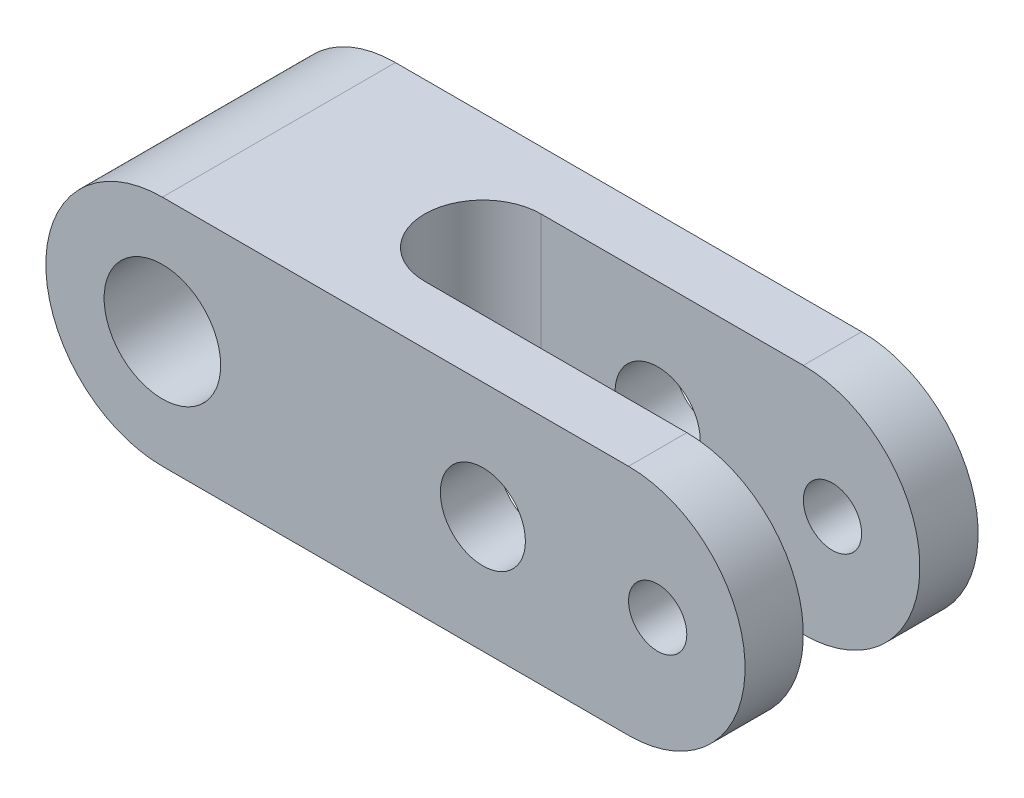
ISO-10303-21;
HEADER;
FILE_DESCRIPTION(('STEP AP214'),'2;1');
FILE_NAME('part.step','',(''),(''),'','','');
FILE_SCHEMA(('AUTOMOTIVE_DESIGN { 1 0 10303 214 1 1 1 1 }'));
ENDSEC;
DATA;
#1=APPLICATION_CONTEXT('core data for automotive mechanical design processes');
#2=APPLICATION_PROTOCOL_DEFINITION('international standard','automotive_design',2000,#1);
#3=PRODUCT_CONTEXT('',#1,'mechanical');
#4=PRODUCT('Part','Part','',(#3));
#5=PRODUCT_RELATED_PRODUCT_CATEGORY('part','',(#4));
#6=PRODUCT_DEFINITION_FORMATION('','',#4);
#7=PRODUCT_DEFINITION_CONTEXT('part definition',#1,'design');
#8=PRODUCT_DEFINITION('design','',#6,#7);
#9=PRODUCT_DEFINITION_SHAPE('','',#8);
#10=(LENGTH_UNIT() NAMED_UNIT(*) SI_UNIT(.MILLI.,.METRE.));
#11=(NAMED_UNIT(*) PLANE_ANGLE_UNIT() SI_UNIT($,.RADIAN.));
#12=(NAMED_UNIT(*) SI_UNIT($,.STERADIAN.) SOLID_ANGLE_UNIT());
#13=UNCERTAINTY_MEASURE_WITH_UNIT(LENGTH_MEASURE(1.E-05),#10,'distance_accuracy_value','');
#14=(GEOMETRIC_REPRESENTATION_CONTEXT(3) GLOBAL_UNCERTAINTY_ASSIGNED_CONTEXT((#13)) GLOBAL_UNIT_ASSIGNED_CONTEXT((#10,
#11,#12)) REPRESENTATION_CONTEXT('',''));
#15=CARTESIAN_POINT('',(0.,0.,0.));
#16=DIRECTION('',(0.,0.,1.));
#17=DIRECTION('',(1.,0.,0.));
#18=AXIS2_PLACEMENT_3D('',#15,#16,#17);
#19=CARTESIAN_POINT('',(-3.17500000000001,12.7,0.));
#20=DIRECTION('',(0.,1.,0.));
#21=DIRECTION('',(-1.,0.,0.));
#22=AXIS2_PLACEMENT_3D('',#19,#20,#21);
#23=CYLINDRICAL_SURFACE('',#22,6.35);
#24=DIRECTION('',(0.,-1.,0.));
#25=VECTOR('',#24,1.);
#26=CARTESIAN_POINT('',(-3.17500000000001,12.7,-6.35));
#27=LINE('',#26,#25);
#28=CARTESIAN_POINT('',(-3.17500000000001,12.7,-6.35));
#29=VERTEX_POINT('',#28);
#30=CARTESIAN_POINT('',(-3.175,-12.7,-6.35));
#31=VERTEX_POINT('',#30);
#32=EDGE_CURVE('E124',#29,#31,#27,.T.);
#33=ORIENTED_EDGE('',*,*,#32,.F.);
#34=CARTESIAN_POINT('',(-3.17500000000001,12.7,0.));
#35=DIRECTION('',(0.,-1.,0.));
#36=DIRECTION('',(1.,0.,0.));
#37=AXIS2_PLACEMENT_3D('',#34,#35,#36);
#38=CIRCLE('',#37,6.35);
#39=CARTESIAN_POINT('',(-3.17500000000001,12.7,6.35));
#40=VERTEX_POINT('',#39);
#41=EDGE_CURVE('E43',#29,#40,#38,.F.);
#42=ORIENTED_EDGE('',*,*,#41,.T.);
#43=DIRECTION('',(0.,-1.,0.));
#44=VECTOR('',#43,1.);
#45=CARTESIAN_POINT('',(-3.17500000000001,12.7,6.35));
#46=LINE('',#45,#44);
#47=CARTESIAN_POINT('',(-3.175,-12.7,6.35));
#48=VERTEX_POINT('',#47);
#49=EDGE_CURVE('E137',#48,#40,#46,.F.);
#50=ORIENTED_EDGE('',*,*,#49,.F.);
#51=CARTESIAN_POINT('',(-3.175,-12.7,0.));
#52=DIRECTION('',(0.,1.,0.));
#53=DIRECTION('',(-1.,0.,0.));
#54=AXIS2_PLACEMENT_3D('',#51,#52,#53);
#55=CIRCLE('',#54,6.35);
#56=EDGE_CURVE('E11',#48,#31,#55,.F.);
#57=ORIENTED_EDGE('',*,*,#56,.T.);
#58=EDGE_LOOP('',(#33,#42,#50,#57));
#59=FACE_BOUND('',#58,.T.);
#60=ADVANCED_FACE('F35',(#59),#23,.F.);
#61=CARTESIAN_POINT('',(25.4,0.,12.7));
#62=DIRECTION('',(0.,0.,-1.));
#63=DIRECTION('',(-1.,0.,0.));
#64=AXIS2_PLACEMENT_3D('',#61,#62,#63);
#65=CYLINDRICAL_SURFACE('',#64,12.7);
#66=DIRECTION('',(0.,0.,-1.));
#67=VECTOR('',#66,1.);
#68=CARTESIAN_POINT('',(25.4,12.7,12.7));
#69=LINE('',#68,#67);
#70=CARTESIAN_POINT('',(25.4,12.7,-6.35));
#71=VERTEX_POINT('',#70);
#72=CARTESIAN_POINT('',(25.4,12.7,-12.7));
#73=VERTEX_POINT('',#72);
#74=EDGE_CURVE('E193',#71,#73,#69,.T.);
#75=ORIENTED_EDGE('',*,*,#74,.F.);
#76=CARTESIAN_POINT('',(25.4,0.,-6.35));
#77=DIRECTION('',(0.,0.,-1.));
#78=DIRECTION('',(-1.,0.,0.));
#79=AXIS2_PLACEMENT_3D('',#76,#77,#78);
#80=CIRCLE('',#79,12.7);
#81=CARTESIAN_POINT('',(25.4,-12.7,-6.35));
#82=VERTEX_POINT('',#81);
#83=EDGE_CURVE('E152',#71,#82,#80,.T.);
#84=ORIENTED_EDGE('',*,*,#83,.T.);
#85=DIRECTION('',(0.,0.,-1.));
#86=VECTOR('',#85,1.);
#87=CARTESIAN_POINT('',(25.4,-12.7,12.7));
#88=LINE('',#87,#86);
#89=CARTESIAN_POINT('',(25.4,-12.7,-12.7));
#90=VERTEX_POINT('',#89);
#91=EDGE_CURVE('E121',#82,#90,#88,.T.);
#92=ORIENTED_EDGE('',*,*,#91,.T.);
#93=CARTESIAN_POINT('',(25.4,0.,-12.7));
#94=DIRECTION('',(0.,0.,1.));
#95=DIRECTION('',(1.,0.,0.));
#96=AXIS2_PLACEMENT_3D('',#93,#94,#95);
#97=CIRCLE('',#96,12.7);
#98=EDGE_CURVE('E189',#90,#73,#97,.T.);
#99=ORIENTED_EDGE('',*,*,#98,.T.);
#100=EDGE_LOOP('',(#75,#84,#92,#99));
#101=FACE_BOUND('',#100,.T.);
#102=ADVANCED_FACE('F202',(#101),#65,.T.);
#103=CARTESIAN_POINT('',(9.525,0.,-30.6605122421383));
#104=DIRECTION('',(0.,0.,1.));
#105=DIRECTION('',(1.,0.,0.));
#106=AXIS2_PLACEMENT_3D('',#103,#104,#105);
#107=CYLINDRICAL_SURFACE('',#106,4.6355);
#108=CARTESIAN_POINT('',(9.525,0.,-6.35));
#109=DIRECTION('',(0.,0.,-1.));
#110=DIRECTION('',(-1.,0.,0.));
#111=AXIS2_PLACEMENT_3D('',#108,#109,#110);
#112=CIRCLE('',#111,4.6355);
#113=CARTESIAN_POINT('',(14.1605,0.,-6.34999999999999));
#114=VERTEX_POINT('',#113);
#115=EDGE_CURVE('E134',#114,#114,#112,.F.);
#116=CARTESIAN_POINT('',(9.525,0.,-12.7));
#117=DIRECTION('',(0.,0.,1.));
#118=DIRECTION('',(1.,0.,0.));
#119=AXIS2_PLACEMENT_3D('',#116,#117,#118);
#120=CIRCLE('',#119,4.6355);
#121=CARTESIAN_POINT('',(14.1605,0.,-12.7));
#122=VERTEX_POINT('',#121);
#123=EDGE_CURVE('E160',#122,#122,#120,.F.);
#124=CARTESIAN_POINT('',(14.1605,0.,-6.34999999999999));
#125=CARTESIAN_POINT('',(14.1605,0.,-6.41614583333333));
#126=CARTESIAN_POINT('',(14.1605,0.,-6.48229166666666));
#127=CARTESIAN_POINT('',(14.1605,0.,-6.61458333333333));
#128=CARTESIAN_POINT('',(14.1605,0.,-6.68072916666666));
#129=CARTESIAN_POINT('',(14.1605,0.,-6.81302083333333));
#130=CARTESIAN_POINT('',(14.1605,0.,-6.87916666666666));
#131=CARTESIAN_POINT('',(14.1605,0.,-7.01145833333333));
#132=CARTESIAN_POINT('',(14.1605,0.,-7.07760416666666));
#133=CARTESIAN_POINT('',(14.1605,0.,-7.20989583333333));
#134=CARTESIAN_POINT('',(14.1605,0.,-7.27604166666666));
#135=CARTESIAN_POINT('',(14.1605,0.,-7.40833333333333));
#136=CARTESIAN_POINT('',(14.1605,0.,-7.47447916666666));
#137=CARTESIAN_POINT('',(14.1605,0.,-7.60677083333333));
#138=CARTESIAN_POINT('',(14.1605,0.,-7.67291666666666));
#139=CARTESIAN_POINT('',(14.1605,0.,-7.80520833333333));
#140=CARTESIAN_POINT('',(14.1605,0.,-7.87135416666666));
#141=CARTESIAN_POINT('',(14.1605,0.,-8.00364583333333));
#142=CARTESIAN_POINT('',(14.1605,0.,-8.06979166666666));
#143=CARTESIAN_POINT('',(14.1605,0.,-8.20208333333333));
#144=CARTESIAN_POINT('',(14.1605,0.,-8.26822916666666));
#145=CARTESIAN_POINT('',(14.1605,0.,-8.40052083333333));
#146=CARTESIAN_POINT('',(14.1605,0.,-8.46666666666666));
#147=CARTESIAN_POINT('',(14.1605,0.,-8.59895833333333));
#148=CARTESIAN_POINT('',(14.1605,0.,-8.66510416666666));
#149=CARTESIAN_POINT('',(14.1605,0.,-8.79739583333333));
#150=CARTESIAN_POINT('',(14.1605,0.,-8.86354166666666));
#151=CARTESIAN_POINT('',(14.1605,0.,-8.99583333333333));
#152=CARTESIAN_POINT('',(14.1605,0.,-9.06197916666666));
#153=CARTESIAN_POINT('',(14.1605,0.,-9.19427083333333));
#154=CARTESIAN_POINT('',(14.1605,0.,-9.26041666666666));
#155=CARTESIAN_POINT('',(14.1605,0.,-9.39270833333333));
#156=CARTESIAN_POINT('',(14.1605,0.,-9.45885416666667));
#157=CARTESIAN_POINT('',(14.1605,0.,-9.59114583333333));
#158=CARTESIAN_POINT('',(14.1605,0.,-9.65729166666666));
#159=CARTESIAN_POINT('',(14.1605,0.,-9.78958333333333));
#160=CARTESIAN_POINT('',(14.1605,0.,-9.85572916666666));
#161=CARTESIAN_POINT('',(14.1605,0.,-9.98802083333333));
#162=CARTESIAN_POINT('',(14.1605,0.,-10.0541666666667));
#163=CARTESIAN_POINT('',(14.1605,0.,-10.1864583333333));
#164=CARTESIAN_POINT('',(14.1605,0.,-10.2526041666667));
#165=CARTESIAN_POINT('',(14.1605,0.,-10.3848958333333));
#166=CARTESIAN_POINT('',(14.1605,0.,-10.4510416666667));
#167=CARTESIAN_POINT('',(14.1605,0.,-10.5833333333333));
#168=CARTESIAN_POINT('',(14.1605,0.,-10.6494791666667));
#169=CARTESIAN_POINT('',(14.1605,0.,-10.7817708333333));
#170=CARTESIAN_POINT('',(14.1605,0.,-10.8479166666667));
#171=CARTESIAN_POINT('',(14.1605,0.,-10.9802083333333));
#172=CARTESIAN_POINT('',(14.1605,0.,-11.0463541666667));
#173=CARTESIAN_POINT('',(14.1605,0.,-11.1786458333333));
#174=CARTESIAN_POINT('',(14.1605,0.,-11.2447916666667));
#175=CARTESIAN_POINT('',(14.1605,0.,-11.3770833333333));
#176=CARTESIAN_POINT('',(14.1605,0.,-11.4432291666667));
#177=CARTESIAN_POINT('',(14.1605,0.,-11.5755208333333));
#178=CARTESIAN_POINT('',(14.1605,0.,-11.6416666666667));
#179=CARTESIAN_POINT('',(14.1605,0.,-11.7739583333333));
#180=CARTESIAN_POINT('',(14.1605,0.,-11.8401041666667));
#181=CARTESIAN_POINT('',(14.1605,0.,-11.9723958333333));
#182=CARTESIAN_POINT('',(14.1605,0.,-12.0385416666667));
#183=CARTESIAN_POINT('',(14.1605,0.,-12.1708333333333));
#184=CARTESIAN_POINT('',(14.1605,0.,-12.2369791666667));
#185=CARTESIAN_POINT('',(14.1605,0.,-12.3692708333333));
#186=CARTESIAN_POINT('',(14.1605,0.,-12.4354166666667));
#187=CARTESIAN_POINT('',(14.1605,0.,-12.5677083333333));
#188=CARTESIAN_POINT('',(14.1605,0.,-12.6338541666667));
#189=CARTESIAN_POINT('',(14.1605,0.,-12.7));
#190=B_SPLINE_CURVE_WITH_KNOTS('',3,(#124,#125,#126,#127,#128,#129,#130,#131,#132,#133,#134,
#135,#136,#137,#138,#139,#140,#141,#142,#143,#144,#145,#146,#147,#148,#149,#150,#151,#152,#153,
#154,#155,#156,#157,#158,#159,#160,#161,#162,#163,#164,#165,#166,#167,#168,#169,#170,#171,#172,
#173,#174,#175,#176,#177,#178,#179,#180,#181,#182,#183,#184,#185,#186,#187,#188,#189),
.UNSPECIFIED.,.F.,.F.,(4,2,2,2,2,2,2,2,2,2,2,2,2,2,2,2,2,2,2,2,2,2,2,2,2,2,2,2,2,2,2,2,4),(0.,
0.198437499999999,0.396875000000001,0.5953125,0.793750000000003,0.992187500000002,1.190625,
1.3890625,1.5875,1.7859375,1.984375,2.1828125,2.38125,2.5796875,2.778125,2.97656250000001,3.175,
3.3734375,3.57187500000001,3.7703125,3.96875000000001,4.16718750000001,4.365625,
4.56406250000001,4.76250000000001,4.96093750000001,5.15937500000001,5.35781250000001,
5.55625000000001,5.75468750000001,5.95312500000001,6.15156250000001,6.35000000000001),.UNSPECIFIED.);
#191=EDGE_CURVE('BSEAM227',#114,#122,#190,.T.);
#192=ORIENTED_EDGE('',*,*,#115,.T.);
#193=ORIENTED_EDGE('',*,*,#123,.T.);
#194=ORIENTED_EDGE('',*,*,#191,.T.);
#195=ORIENTED_EDGE('',*,*,#191,.F.);
#196=EDGE_LOOP('',(#192,#194,#193,#195));
#197=FACE_BOUND('',#196,.T.);
#198=ADVANCED_FACE('F227',(#197),#107,.F.);
#199=CARTESIAN_POINT('',(28.575,0.,-30.6605122421383));
#200=DIRECTION('',(0.,0.,1.));
#201=DIRECTION('',(1.,0.,0.));
#202=AXIS2_PLACEMENT_3D('',#199,#200,#201);
#203=CYLINDRICAL_SURFACE('',#202,3.175);
#204=CARTESIAN_POINT('',(28.575,0.,-6.35));
#205=DIRECTION('',(0.,0.,-1.));
#206=DIRECTION('',(-1.,0.,0.));
#207=AXIS2_PLACEMENT_3D('',#204,#205,#206);
#208=CIRCLE('',#207,3.175);
#209=CARTESIAN_POINT('',(31.75,0.,-6.34999999999999));
#210=VERTEX_POINT('',#209);
#211=EDGE_CURVE('E107',#210,#210,#208,.F.);
#212=CARTESIAN_POINT('',(28.575,0.,-12.7));
#213=DIRECTION('',(0.,0.,1.));
#214=DIRECTION('',(1.,0.,0.));
#215=AXIS2_PLACEMENT_3D('',#212,#213,#214);
#216=CIRCLE('',#215,3.175);
#217=CARTESIAN_POINT('',(31.75,0.,-12.7));
#218=VERTEX_POINT('',#217);
#219=EDGE_CURVE('E159',#218,#218,#216,.F.);
#220=CARTESIAN_POINT('',(31.75,0.,-6.34999999999999));
#221=CARTESIAN_POINT('',(31.75,0.,-6.41614583333333));
#222=CARTESIAN_POINT('',(31.75,0.,-6.48229166666666));
#223=CARTESIAN_POINT('',(31.75,0.,-6.61458333333333));
#224=CARTESIAN_POINT('',(31.75,0.,-6.68072916666666));
#225=CARTESIAN_POINT('',(31.75,0.,-6.81302083333333));
#226=CARTESIAN_POINT('',(31.75,0.,-6.87916666666666));
#227=CARTESIAN_POINT('',(31.75,0.,-7.01145833333333));
#228=CARTESIAN_POINT('',(31.75,0.,-7.07760416666666));
#229=CARTESIAN_POINT('',(31.75,0.,-7.20989583333333));
#230=CARTESIAN_POINT('',(31.75,0.,-7.27604166666666));
#231=CARTESIAN_POINT('',(31.75,0.,-7.40833333333333));
#232=CARTESIAN_POINT('',(31.75,0.,-7.47447916666666));
#233=CARTESIAN_POINT('',(31.75,0.,-7.60677083333333));
#234=CARTESIAN_POINT('',(31.75,0.,-7.67291666666666));
#235=CARTESIAN_POINT('',(31.75,0.,-7.80520833333333));
#236=CARTESIAN_POINT('',(31.75,0.,-7.87135416666666));
#237=CARTESIAN_POINT('',(31.75,0.,-8.00364583333333));
#238=CARTESIAN_POINT('',(31.75,0.,-8.06979166666666));
#239=CARTESIAN_POINT('',(31.75,0.,-8.20208333333333));
#240=CARTESIAN_POINT('',(31.75,0.,-8.26822916666666));
#241=CARTESIAN_POINT('',(31.75,0.,-8.40052083333333));
#242=CARTESIAN_POINT('',(31.75,0.,-8.46666666666666));
#243=CARTESIAN_POINT('',(31.75,0.,-8.59895833333333));
#244=CARTESIAN_POINT('',(31.75,0.,-8.66510416666666));
#245=CARTESIAN_POINT('',(31.75,0.,-8.79739583333333));
#246=CARTESIAN_POINT('',(31.75,0.,-8.86354166666666));
#247=CARTESIAN_POINT('',(31.75,0.,-8.99583333333333));
#248=CARTESIAN_POINT('',(31.75,0.,-9.06197916666666));
#249=CARTESIAN_POINT('',(31.75,0.,-9.19427083333333));
#250=CARTESIAN_POINT('',(31.75,0.,-9.26041666666666));
#251=CARTESIAN_POINT('',(31.75,0.,-9.39270833333333));
#252=CARTESIAN_POINT('',(31.75,0.,-9.45885416666667));
#253=CARTESIAN_POINT('',(31.75,0.,-9.59114583333333));
#254=CARTESIAN_POINT('',(31.75,0.,-9.65729166666666));
#255=CARTESIAN_POINT('',(31.75,0.,-9.78958333333333));
#256=CARTESIAN_POINT('',(31.75,0.,-9.85572916666666));
#257=CARTESIAN_POINT('',(31.75,0.,-9.98802083333333));
#258=CARTESIAN_POINT('',(31.75,0.,-10.0541666666667));
#259=CARTESIAN_POINT('',(31.75,0.,-10.1864583333333));
#260=CARTESIAN_POINT('',(31.75,0.,-10.2526041666667));
#261=CARTESIAN_POINT('',(31.75,0.,-10.3848958333333));
#262=CARTESIAN_POINT('',(31.75,0.,-10.4510416666667));
#263=CARTESIAN_POINT('',(31.75,0.,-10.5833333333333));
#264=CARTESIAN_POINT('',(31.75,0.,-10.6494791666667));
#265=CARTESIAN_POINT('',(31.75,0.,-10.7817708333333));
#266=CARTESIAN_POINT('',(31.75,0.,-10.8479166666667));
#267=CARTESIAN_POINT('',(31.75,0.,-10.9802083333333));
#268=CARTESIAN_POINT('',(31.75,0.,-11.0463541666667));
#269=CARTESIAN_POINT('',(31.75,0.,-11.1786458333333));
#270=CARTESIAN_POINT('',(31.75,0.,-11.2447916666667));
#271=CARTESIAN_POINT('',(31.75,0.,-11.3770833333333));
#272=CARTESIAN_POINT('',(31.75,0.,-11.4432291666667));
#273=CARTESIAN_POINT('',(31.75,0.,-11.5755208333333));
#274=CARTESIAN_POINT('',(31.75,0.,-11.6416666666667));
#275=CARTESIAN_POINT('',(31.75,0.,-11.7739583333333));
#276=CARTESIAN_POINT('',(31.75,0.,-11.8401041666667));
#277=CARTESIAN_POINT('',(31.75,0.,-11.9723958333333));
#278=CARTESIAN_POINT('',(31.75,0.,-12.0385416666667));
#279=CARTESIAN_POINT('',(31.75,0.,-12.1708333333333));
#280=CARTESIAN_POINT('',(31.75,0.,-12.2369791666667));
#281=CARTESIAN_POINT('',(31.75,0.,-12.3692708333333));
#282=CARTESIAN_POINT('',(31.75,0.,-12.4354166666667));
#283=CARTESIAN_POINT('',(31.75,0.,-12.5677083333333));
#284=CARTESIAN_POINT('',(31.75,0.,-12.6338541666667));
#285=CARTESIAN_POINT('',(31.75,0.,-12.7));
#286=B_SPLINE_CURVE_WITH_KNOTS('',3,(#220,#221,#222,#223,#224,#225,#226,#227,#228,#229,#230,
#231,#232,#233,#234,#235,#236,#237,#238,#239,#240,#241,#242,#243,#244,#245,#246,#247,#248,#249,
#250,#251,#252,#253,#254,#255,#256,#257,#258,#259,#260,#261,#262,#263,#264,#265,#266,#267,#268,
#269,#270,#271,#272,#273,#274,#275,#276,#277,#278,#279,#280,#281,#282,#283,#284,#285),
.UNSPECIFIED.,.F.,.F.,(4,2,2,2,2,2,2,2,2,2,2,2,2,2,2,2,2,2,2,2,2,2,2,2,2,2,2,2,2,2,2,2,4),(0.,
0.198437499999999,0.396875000000001,0.5953125,0.793750000000003,0.992187500000002,1.190625,
1.3890625,1.5875,1.7859375,1.984375,2.1828125,2.38125,2.5796875,2.778125,2.97656250000001,3.175,
3.3734375,3.57187500000001,3.7703125,3.96875000000001,4.16718750000001,4.365625,
4.56406250000001,4.76250000000001,4.96093750000001,5.15937500000001,5.35781250000001,
5.55625000000001,5.75468750000001,5.95312500000001,6.15156250000001,6.35000000000001),.UNSPECIFIED.);
#287=EDGE_CURVE('BSEAM244',#210,#218,#286,.T.);
#288=ORIENTED_EDGE('',*,*,#211,.T.);
#289=ORIENTED_EDGE('',*,*,#219,.T.);
#290=ORIENTED_EDGE('',*,*,#287,.T.);
#291=ORIENTED_EDGE('',*,*,#287,.F.);
#292=EDGE_LOOP('',(#288,#290,#289,#291));
#293=FACE_BOUND('',#292,.T.);
#294=ADVANCED_FACE('F244',(#293),#203,.F.);
#295=CARTESIAN_POINT('',(-25.4,0.,12.7));
#296=DIRECTION('',(0.,0.,-1.));
#297=DIRECTION('',(-1.,0.,0.));
#298=AXIS2_PLACEMENT_3D('',#295,#296,#297);
#299=CYLINDRICAL_SURFACE('',#298,12.7);
#300=CARTESIAN_POINT('',(-25.4,0.,-12.7));
#301=DIRECTION('',(0.,0.,1.));
#302=DIRECTION('',(1.,0.,0.));
#303=AXIS2_PLACEMENT_3D('',#300,#301,#302);
#304=CIRCLE('',#303,12.7);
#305=CARTESIAN_POINT('',(-25.4,12.7,-12.7));
#306=VERTEX_POINT('',#305);
#307=CARTESIAN_POINT('',(-25.4,-12.7,-12.7));
#308=VERTEX_POINT('',#307);
#309=EDGE_CURVE('E163',#306,#308,#304,.T.);
#310=ORIENTED_EDGE('',*,*,#309,.T.);
#311=DIRECTION('',(0.,0.,-1.));
#312=VECTOR('',#311,1.);
#313=CARTESIAN_POINT('',(-25.4,-12.7,12.7));
#314=LINE('',#313,#312);
#315=CARTESIAN_POINT('',(-25.4,-12.7,12.7));
#316=VERTEX_POINT('',#315);
#317=EDGE_CURVE('E120',#316,#308,#314,.T.);
#318=ORIENTED_EDGE('',*,*,#317,.F.);
#319=CARTESIAN_POINT('',(-25.4,0.,12.7));
#320=DIRECTION('',(0.,0.,1.));
#321=DIRECTION('',(1.,0.,0.));
#322=AXIS2_PLACEMENT_3D('',#319,#320,#321);
#323=CIRCLE('',#322,12.7);
#324=CARTESIAN_POINT('',(-25.4,12.7,12.7));
#325=VERTEX_POINT('',#324);
#326=EDGE_CURVE('E174',#325,#316,#323,.T.);
#327=ORIENTED_EDGE('',*,*,#326,.F.);
#328=DIRECTION('',(0.,0.,-1.));
#329=VECTOR('',#328,1.);
#330=CARTESIAN_POINT('',(-25.4,12.7,12.7));
#331=LINE('',#330,#329);
#332=EDGE_CURVE('E183',#325,#306,#331,.T.);
#333=ORIENTED_EDGE('',*,*,#332,.T.);
#334=EDGE_LOOP('',(#310,#318,#327,#333));
#335=FACE_BOUND('',#334,.T.);
#336=ADVANCED_FACE('F206',(#335),#299,.T.);
#337=CARTESIAN_POINT('',(-25.4,-12.7,12.7));
#338=DIRECTION('',(0.,1.,0.));
#339=DIRECTION('',(-1.,0.,0.));
#340=AXIS2_PLACEMENT_3D('',#337,#338,#339);
#341=PLANE('',#340);
#342=ORIENTED_EDGE('',*,*,#91,.F.);
#343=DIRECTION('',(1.,0.,0.));
#344=VECTOR('',#343,1.);
#345=CARTESIAN_POINT('',(-9.525,-12.7,-6.35));
#346=LINE('',#345,#344);
#347=EDGE_CURVE('E116',#31,#82,#346,.T.);
#348=ORIENTED_EDGE('',*,*,#347,.F.);
#349=ORIENTED_EDGE('',*,*,#56,.F.);
#350=DIRECTION('',(-1.,0.,0.));
#351=VECTOR('',#350,1.);
#352=CARTESIAN_POINT('',(-9.525,-12.7,6.35));
#353=LINE('',#352,#351);
#354=CARTESIAN_POINT('',(25.4,-12.7,6.35));
#355=VERTEX_POINT('',#354);
#356=EDGE_CURVE('E100',#355,#48,#353,.T.);
#357=ORIENTED_EDGE('',*,*,#356,.F.);
#358=CARTESIAN_POINT('',(25.4,-12.7,12.7));
#359=VERTEX_POINT('',#358);
#360=EDGE_CURVE('E113',#359,#355,#88,.T.);
#361=ORIENTED_EDGE('',*,*,#360,.F.);
#362=DIRECTION('',(1.,0.,0.));
#363=VECTOR('',#362,1.);
#364=CARTESIAN_POINT('',(-25.4,-12.7,12.7));
#365=LINE('',#364,#363);
#366=EDGE_CURVE('E177',#316,#359,#365,.T.);
#367=ORIENTED_EDGE('',*,*,#366,.F.);
#368=ORIENTED_EDGE('',*,*,#317,.T.);
#369=DIRECTION('',(1.,0.,0.));
#370=VECTOR('',#369,1.);
#371=CARTESIAN_POINT('',(-25.4,-12.7,-12.7));
#372=LINE('',#371,#370);
#373=EDGE_CURVE('E186',#308,#90,#372,.T.);
#374=ORIENTED_EDGE('',*,*,#373,.T.);
#375=EDGE_LOOP('',(#342,#348,#349,#357,#361,#367,#368,#374));
#376=FACE_BOUND('',#375,.T.);
#377=ADVANCED_FACE('F112',(#376),#341,.F.);
#378=CARTESIAN_POINT('',(25.4,0.,6.35));
#379=DIRECTION('',(0.,0.,1.));
#380=DIRECTION('',(1.,0.,0.));
#381=AXIS2_PLACEMENT_3D('',#378,#379,#380);
#382=CIRCLE('',#381,12.7);
#383=CARTESIAN_POINT('',(25.4,12.7,6.35));
#384=VERTEX_POINT('',#383);
#385=EDGE_CURVE('E98',#355,#384,#382,.T.);
#386=ORIENTED_EDGE('',*,*,#385,.T.);
#387=CARTESIAN_POINT('',(25.4,12.7,12.7));
#388=VERTEX_POINT('',#387);
#389=EDGE_CURVE('E126',#388,#384,#69,.T.);
#390=ORIENTED_EDGE('',*,*,#389,.F.);
#391=CARTESIAN_POINT('',(25.4,0.,12.7));
#392=DIRECTION('',(0.,0.,1.));
#393=DIRECTION('',(1.,0.,0.));
#394=AXIS2_PLACEMENT_3D('',#391,#392,#393);
#395=CIRCLE('',#394,12.7);
#396=EDGE_CURVE('E119',#359,#388,#395,.T.);
#397=ORIENTED_EDGE('',*,*,#396,.F.);
#398=ORIENTED_EDGE('',*,*,#360,.T.);
#399=EDGE_LOOP('',(#386,#390,#397,#398));
#400=FACE_BOUND('',#399,.T.);
#401=ADVANCED_FACE('F118',(#400),#65,.T.);
#402=CARTESIAN_POINT('',(-25.4,12.7,12.7));
#403=DIRECTION('',(0.,-1.,0.));
#404=DIRECTION('',(1.,0.,0.));
#405=AXIS2_PLACEMENT_3D('',#402,#403,#404);
#406=PLANE('',#405);
#407=ORIENTED_EDGE('',*,*,#41,.F.);
#408=DIRECTION('',(-1.,0.,0.));
#409=VECTOR('',#408,1.);
#410=CARTESIAN_POINT('',(-9.52500000000001,12.7,-6.35));
#411=LINE('',#410,#409);
#412=EDGE_CURVE('E142',#71,#29,#411,.T.);
#413=ORIENTED_EDGE('',*,*,#412,.F.);
#414=ORIENTED_EDGE('',*,*,#74,.T.);
#415=DIRECTION('',(-1.,0.,0.));
#416=VECTOR('',#415,1.);
#417=CARTESIAN_POINT('',(-25.4,12.7,-12.7));
#418=LINE('',#417,#416);
#419=EDGE_CURVE('E178',#73,#306,#418,.T.);
#420=ORIENTED_EDGE('',*,*,#419,.T.);
#421=ORIENTED_EDGE('',*,*,#332,.F.);
#422=DIRECTION('',(-1.,0.,0.));
#423=VECTOR('',#422,1.);
#424=CARTESIAN_POINT('',(-25.4,12.7,12.7));
#425=LINE('',#424,#423);
#426=EDGE_CURVE('E181',#388,#325,#425,.T.);
#427=ORIENTED_EDGE('',*,*,#426,.F.);
#428=ORIENTED_EDGE('',*,*,#389,.T.);
#429=DIRECTION('',(1.,0.,0.));
#430=VECTOR('',#429,1.);
#431=CARTESIAN_POINT('',(-9.52500000000001,12.7,6.35));
#432=LINE('',#431,#430);
#433=EDGE_CURVE('E102',#40,#384,#432,.T.);
#434=ORIENTED_EDGE('',*,*,#433,.F.);
#435=EDGE_LOOP('',(#407,#413,#414,#420,#421,#427,#428,#434));
#436=FACE_BOUND('',#435,.T.);
#437=ADVANCED_FACE('F139',(#436),#406,.F.);
#438=CARTESIAN_POINT('',(-25.4,0.,12.7));
#439=DIRECTION('',(0.,0.,1.));
#440=DIRECTION('',(1.,0.,0.));
#441=AXIS2_PLACEMENT_3D('',#438,#439,#440);
#442=PLANE('',#441);
#443=CARTESIAN_POINT('',(28.575,0.,12.7));
#444=DIRECTION('',(0.,0.,1.));
#445=DIRECTION('',(1.,0.,0.));
#446=AXIS2_PLACEMENT_3D('',#443,#444,#445);
#447=CIRCLE('',#446,3.175);
#448=CARTESIAN_POINT('',(31.75,0.,12.7));
#449=VERTEX_POINT('',#448);
#450=EDGE_CURVE('E156',#449,#449,#447,.T.);
#451=ORIENTED_EDGE('',*,*,#450,.F.);
#452=EDGE_LOOP('',(#451));
#453=FACE_BOUND('',#452,.T.);
#454=CARTESIAN_POINT('',(9.525,0.,12.7));
#455=DIRECTION('',(0.,0.,1.));
#456=DIRECTION('',(1.,0.,0.));
#457=AXIS2_PLACEMENT_3D('',#454,#455,#456);
#458=CIRCLE('',#457,4.6355);
#459=CARTESIAN_POINT('',(14.1605,0.,12.7));
#460=VERTEX_POINT('',#459);
#461=EDGE_CURVE('E164',#460,#460,#458,.T.);
#462=ORIENTED_EDGE('',*,*,#461,.F.);
#463=EDGE_LOOP('',(#462));
#464=FACE_BOUND('',#463,.T.);
#465=CARTESIAN_POINT('',(-25.4,0.,12.7));
#466=DIRECTION('',(0.,0.,1.));
#467=DIRECTION('',(1.,0.,0.));
#468=AXIS2_PLACEMENT_3D('',#465,#466,#467);
#469=CIRCLE('',#468,6.35);
#470=CARTESIAN_POINT('',(-19.05,0.,12.7));
#471=VERTEX_POINT('',#470);
#472=EDGE_CURVE('E155',#471,#471,#469,.T.);
#473=ORIENTED_EDGE('',*,*,#472,.F.);
#474=EDGE_LOOP('',(#473));
#475=FACE_BOUND('',#474,.T.);
#476=ORIENTED_EDGE('',*,*,#326,.T.);
#477=ORIENTED_EDGE('',*,*,#366,.T.);
#478=ORIENTED_EDGE('',*,*,#396,.T.);
#479=ORIENTED_EDGE('',*,*,#426,.T.);
#480=EDGE_LOOP('',(#476,#477,#478,#479));
#481=FACE_BOUND('',#480,.T.);
#482=ADVANCED_FACE('F208',(#453,#464,#475,#481),#442,.T.);
#483=CARTESIAN_POINT('',(-25.4,0.,-12.7));
#484=DIRECTION('',(0.,0.,1.));
#485=DIRECTION('',(1.,0.,0.));
#486=AXIS2_PLACEMENT_3D('',#483,#484,#485);
#487=PLANE('',#486);
#488=ORIENTED_EDGE('',*,*,#219,.F.);
#489=EDGE_LOOP('',(#488));
#490=FACE_BOUND('',#489,.T.);
#491=ORIENTED_EDGE('',*,*,#123,.F.);
#492=EDGE_LOOP('',(#491));
#493=FACE_BOUND('',#492,.T.);
#494=CARTESIAN_POINT('',(-25.4,0.,-12.7));
#495=DIRECTION('',(0.,0.,1.));
#496=DIRECTION('',(1.,0.,0.));
#497=AXIS2_PLACEMENT_3D('',#494,#495,#496);
#498=CIRCLE('',#497,6.35);
#499=CARTESIAN_POINT('',(-19.05,0.,-12.7));
#500=VERTEX_POINT('',#499);
#501=EDGE_CURVE('E167',#500,#500,#498,.F.);
#502=ORIENTED_EDGE('',*,*,#501,.F.);
#503=EDGE_LOOP('',(#502));
#504=FACE_BOUND('',#503,.T.);
#505=ORIENTED_EDGE('',*,*,#309,.F.);
#506=ORIENTED_EDGE('',*,*,#419,.F.);
#507=ORIENTED_EDGE('',*,*,#98,.F.);
#508=ORIENTED_EDGE('',*,*,#373,.F.);
#509=EDGE_LOOP('',(#505,#506,#507,#508));
#510=FACE_BOUND('',#509,.T.);
#511=ADVANCED_FACE('F204',(#490,#493,#504,#510),#487,.F.);
#512=CARTESIAN_POINT('',(-25.4,0.,-30.6605122421383));
#513=DIRECTION('',(0.,0.,1.));
#514=DIRECTION('',(1.,0.,0.));
#515=AXIS2_PLACEMENT_3D('',#512,#513,#514);
#516=CYLINDRICAL_SURFACE('',#515,6.35);
#517=CARTESIAN_POINT('',(-19.05,0.,-12.7));
#518=CARTESIAN_POINT('',(-19.05,0.,-12.4354166666667));
#519=CARTESIAN_POINT('',(-19.05,0.,-12.1708333333333));
#520=CARTESIAN_POINT('',(-19.05,0.,-11.6416666666667));
#521=CARTESIAN_POINT('',(-19.05,0.,-11.3770833333333));
#522=CARTESIAN_POINT('',(-19.05,0.,-10.8479166666667));
#523=CARTESIAN_POINT('',(-19.05,0.,-10.5833333333333));
#524=CARTESIAN_POINT('',(-19.05,0.,-10.0541666666667));
#525=CARTESIAN_POINT('',(-19.05,0.,-9.78958333333334));
#526=CARTESIAN_POINT('',(-19.05,0.,-9.26041666666667));
#527=CARTESIAN_POINT('',(-19.05,0.,-8.99583333333334));
#528=CARTESIAN_POINT('',(-19.05,0.,-8.46666666666667));
#529=CARTESIAN_POINT('',(-19.05,0.,-8.20208333333334));
#530=CARTESIAN_POINT('',(-19.05,0.,-7.67291666666667));
#531=CARTESIAN_POINT('',(-19.05,0.,-7.40833333333334));
#532=CARTESIAN_POINT('',(-19.05,0.,-6.87916666666667));
#533=CARTESIAN_POINT('',(-19.05,0.,-6.61458333333334));
#534=CARTESIAN_POINT('',(-19.05,0.,-6.08541666666667));
#535=CARTESIAN_POINT('',(-19.05,0.,-5.82083333333333));
#536=CARTESIAN_POINT('',(-19.05,0.,-5.29166666666667));
#537=CARTESIAN_POINT('',(-19.05,0.,-5.02708333333334));
#538=CARTESIAN_POINT('',(-19.05,0.,-4.49791666666667));
#539=CARTESIAN_POINT('',(-19.05,0.,-4.23333333333334));
#540=CARTESIAN_POINT('',(-19.05,0.,-3.70416666666667));
#541=CARTESIAN_POINT('',(-19.05,0.,-3.43958333333334));
#542=CARTESIAN_POINT('',(-19.05,0.,-2.91041666666667));
#543=CARTESIAN_POINT('',(-19.05,0.,-2.64583333333334));
#544=CARTESIAN_POINT('',(-19.05,0.,-2.11666666666667));
#545=CARTESIAN_POINT('',(-19.05,0.,-1.85208333333334));
#546=CARTESIAN_POINT('',(-19.05,0.,-1.32291666666667));
#547=CARTESIAN_POINT('',(-19.05,0.,-1.05833333333334));
#548=CARTESIAN_POINT('',(-19.05,0.,-0.52916666666667));
#549=CARTESIAN_POINT('',(-19.05,0.,-0.264583333333337));
#550=CARTESIAN_POINT('',(-19.05,0.,0.264583333333329));
#551=CARTESIAN_POINT('',(-19.05,0.,0.52916666666666));
#552=CARTESIAN_POINT('',(-19.05,0.,1.05833333333333));
#553=CARTESIAN_POINT('',(-19.05,0.,1.32291666666666));
#554=CARTESIAN_POINT('',(-19.05,0.,1.85208333333333));
#555=CARTESIAN_POINT('',(-19.05,0.,2.11666666666666));
#556=CARTESIAN_POINT('',(-19.05,0.,2.64583333333333));
#557=CARTESIAN_POINT('',(-19.05,0.,2.91041666666666));
#558=CARTESIAN_POINT('',(-19.05,0.,3.43958333333333));
#559=CARTESIAN_POINT('',(-19.05,0.,3.70416666666666));
#560=CARTESIAN_POINT('',(-19.05,0.,4.23333333333333));
#561=CARTESIAN_POINT('',(-19.05,0.,4.49791666666666));
#562=CARTESIAN_POINT('',(-19.05,0.,5.02708333333332));
#563=CARTESIAN_POINT('',(-19.05,0.,5.29166666666666));
#564=CARTESIAN_POINT('',(-19.05,0.,5.82083333333332));
#565=CARTESIAN_POINT('',(-19.05,0.,6.08541666666666));
#566=CARTESIAN_POINT('',(-19.05,0.,6.61458333333333));
#567=CARTESIAN_POINT('',(-19.05,0.,6.87916666666666));
#568=CARTESIAN_POINT('',(-19.05,0.,7.40833333333333));
#569=CARTESIAN_POINT('',(-19.05,0.,7.67291666666666));
#570=CARTESIAN_POINT('',(-19.05,0.,8.20208333333332));
#571=CARTESIAN_POINT('',(-19.05,0.,8.46666666666666));
#572=CARTESIAN_POINT('',(-19.05,0.,8.99583333333333));
#573=CARTESIAN_POINT('',(-19.05,0.,9.26041666666666));
#574=CARTESIAN_POINT('',(-19.05,0.,9.78958333333333));
#575=CARTESIAN_POINT('',(-19.05,0.,10.0541666666667));
#576=CARTESIAN_POINT('',(-19.05,0.,10.5833333333333));
#577=CARTESIAN_POINT('',(-19.05,0.,10.8479166666667));
#578=CARTESIAN_POINT('',(-19.05,0.,11.3770833333333));
#579=CARTESIAN_POINT('',(-19.05,0.,11.6416666666667));
#580=CARTESIAN_POINT('',(-19.05,0.,12.1708333333333));
#581=CARTESIAN_POINT('',(-19.05,0.,12.4354166666667));
#582=CARTESIAN_POINT('',(-19.05,0.,12.7));
#583=B_SPLINE_CURVE_WITH_KNOTS('',3,(#517,#518,#519,#520,#521,#522,#523,#524,#525,#526,#527,
#528,#529,#530,#531,#532,#533,#534,#535,#536,#537,#538,#539,#540,#541,#542,#543,#544,#545,#546,
#547,#548,#549,#550,#551,#552,#553,#554,#555,#556,#557,#558,#559,#560,#561,#562,#563,#564,#565,
#566,#567,#568,#569,#570,#571,#572,#573,#574,#575,#576,#577,#578,#579,#580,#581,#582),
.UNSPECIFIED.,.F.,.F.,(4,2,2,2,2,2,2,2,2,2,2,2,2,2,2,2,2,2,2,2,2,2,2,2,2,2,2,2,2,2,2,2,4),(0.,
0.793749999999999,1.5875,2.38125,3.175,3.96875,4.7625,5.55625,6.35,7.14375,7.9375,8.73125,9.525,
10.31875,11.1125,11.90625,12.7,13.49375,14.2875,15.08125,15.875,16.66875,17.4625,18.25625,19.05,
19.84375,20.6375,21.43125,22.225,23.01875,23.8125,24.60625,25.4),.UNSPECIFIED.);
#584=EDGE_CURVE('BSEAM216',#500,#471,#583,.T.);
#585=ORIENTED_EDGE('',*,*,#501,.T.);
#586=ORIENTED_EDGE('',*,*,#472,.T.);
#587=ORIENTED_EDGE('',*,*,#584,.T.);
#588=ORIENTED_EDGE('',*,*,#584,.F.);
#589=EDGE_LOOP('',(#585,#587,#586,#588));
#590=FACE_BOUND('',#589,.T.);
#591=ADVANCED_FACE('F216',(#590),#516,.F.);
#592=CARTESIAN_POINT('',(9.525,0.,6.35));
#593=DIRECTION('',(0.,0.,1.));
#594=DIRECTION('',(1.,0.,0.));
#595=AXIS2_PLACEMENT_3D('',#592,#593,#594);
#596=CIRCLE('',#595,4.6355);
#597=CARTESIAN_POINT('',(14.1605,0.,6.35));
#598=VERTEX_POINT('',#597);
#599=EDGE_CURVE('E108',#598,#598,#596,.F.);
#600=CARTESIAN_POINT('',(14.1605,0.,6.35));
#601=CARTESIAN_POINT('',(14.1605,0.,6.41614583333333));
#602=CARTESIAN_POINT('',(14.1605,0.,6.48229166666667));
#603=CARTESIAN_POINT('',(14.1605,0.,6.61458333333333));
#604=CARTESIAN_POINT('',(14.1605,0.,6.68072916666666));
#605=CARTESIAN_POINT('',(14.1605,0.,6.81302083333333));
#606=CARTESIAN_POINT('',(14.1605,0.,6.87916666666666));
#607=CARTESIAN_POINT('',(14.1605,0.,7.01145833333333));
#608=CARTESIAN_POINT('',(14.1605,0.,7.07760416666666));
#609=CARTESIAN_POINT('',(14.1605,0.,7.20989583333333));
#610=CARTESIAN_POINT('',(14.1605,0.,7.27604166666666));
#611=CARTESIAN_POINT('',(14.1605,0.,7.40833333333333));
#612=CARTESIAN_POINT('',(14.1605,0.,7.47447916666667));
#613=CARTESIAN_POINT('',(14.1605,0.,7.60677083333333));
#614=CARTESIAN_POINT('',(14.1605,0.,7.67291666666666));
#615=CARTESIAN_POINT('',(14.1605,0.,7.80520833333333));
#616=CARTESIAN_POINT('',(14.1605,0.,7.87135416666666));
#617=CARTESIAN_POINT('',(14.1605,0.,8.00364583333333));
#618=CARTESIAN_POINT('',(14.1605,0.,8.06979166666666));
#619=CARTESIAN_POINT('',(14.1605,0.,8.20208333333333));
#620=CARTESIAN_POINT('',(14.1605,0.,8.26822916666666));
#621=CARTESIAN_POINT('',(14.1605,0.,8.40052083333333));
#622=CARTESIAN_POINT('',(14.1605,0.,8.46666666666666));
#623=CARTESIAN_POINT('',(14.1605,0.,8.59895833333333));
#624=CARTESIAN_POINT('',(14.1605,0.,8.66510416666666));
#625=CARTESIAN_POINT('',(14.1605,0.,8.79739583333333));
#626=CARTESIAN_POINT('',(14.1605,0.,8.86354166666666));
#627=CARTESIAN_POINT('',(14.1605,0.,8.99583333333333));
#628=CARTESIAN_POINT('',(14.1605,0.,9.06197916666666));
#629=CARTESIAN_POINT('',(14.1605,0.,9.19427083333333));
#630=CARTESIAN_POINT('',(14.1605,0.,9.26041666666666));
#631=CARTESIAN_POINT('',(14.1605,0.,9.39270833333333));
#632=CARTESIAN_POINT('',(14.1605,0.,9.45885416666666));
#633=CARTESIAN_POINT('',(14.1605,0.,9.59114583333333));
#634=CARTESIAN_POINT('',(14.1605,0.,9.65729166666666));
#635=CARTESIAN_POINT('',(14.1605,0.,9.78958333333333));
#636=CARTESIAN_POINT('',(14.1605,0.,9.85572916666666));
#637=CARTESIAN_POINT('',(14.1605,0.,9.98802083333333));
#638=CARTESIAN_POINT('',(14.1605,0.,10.0541666666667));
#639=CARTESIAN_POINT('',(14.1605,0.,10.1864583333333));
#640=CARTESIAN_POINT('',(14.1605,0.,10.2526041666667));
#641=CARTESIAN_POINT('',(14.1605,0.,10.3848958333333));
#642=CARTESIAN_POINT('',(14.1605,0.,10.4510416666667));
#643=CARTESIAN_POINT('',(14.1605,0.,10.5833333333333));
#644=CARTESIAN_POINT('',(14.1605,0.,10.6494791666667));
#645=CARTESIAN_POINT('',(14.1605,0.,10.7817708333333));
#646=CARTESIAN_POINT('',(14.1605,0.,10.8479166666667));
#647=CARTESIAN_POINT('',(14.1605,0.,10.9802083333333));
#648=CARTESIAN_POINT('',(14.1605,0.,11.0463541666667));
#649=CARTESIAN_POINT('',(14.1605,0.,11.1786458333333));
#650=CARTESIAN_POINT('',(14.1605,0.,11.2447916666667));
#651=CARTESIAN_POINT('',(14.1605,0.,11.3770833333333));
#652=CARTESIAN_POINT('',(14.1605,0.,11.4432291666667));
#653=CARTESIAN_POINT('',(14.1605,0.,11.5755208333333));
#654=CARTESIAN_POINT('',(14.1605,0.,11.6416666666667));
#655=CARTESIAN_POINT('',(14.1605,0.,11.7739583333333));
#656=CARTESIAN_POINT('',(14.1605,0.,11.8401041666667));
#657=CARTESIAN_POINT('',(14.1605,0.,11.9723958333333));
#658=CARTESIAN_POINT('',(14.1605,0.,12.0385416666667));
#659=CARTESIAN_POINT('',(14.1605,0.,12.1708333333333));
#660=CARTESIAN_POINT('',(14.1605,0.,12.2369791666667));
#661=CARTESIAN_POINT('',(14.1605,0.,12.3692708333333));
#662=CARTESIAN_POINT('',(14.1605,0.,12.4354166666667));
#663=CARTESIAN_POINT('',(14.1605,0.,12.5677083333333));
#664=CARTESIAN_POINT('',(14.1605,0.,12.6338541666667));
#665=CARTESIAN_POINT('',(14.1605,0.,12.7));
#666=B_SPLINE_CURVE_WITH_KNOTS('',3,(#600,#601,#602,#603,#604,#605,#606,#607,#608,#609,#610,
#611,#612,#613,#614,#615,#616,#617,#618,#619,#620,#621,#622,#623,#624,#625,#626,#627,#628,#629,
#630,#631,#632,#633,#634,#635,#636,#637,#638,#639,#640,#641,#642,#643,#644,#645,#646,#647,#648,
#649,#650,#651,#652,#653,#654,#655,#656,#657,#658,#659,#660,#661,#662,#663,#664,#665),
.UNSPECIFIED.,.F.,.F.,(4,2,2,2,2,2,2,2,2,2,2,2,2,2,2,2,2,2,2,2,2,2,2,2,2,2,2,2,2,2,2,2,4),(0.,
0.198437500000002,0.396874999999998,0.5953125,0.793749999999996,0.992187499999998,1.190625,
1.3890625,1.5875,1.7859375,1.984375,2.1828125,2.38125,2.5796875,2.778125,2.97656249999999,3.175,
3.3734375,3.571875,3.7703125,3.96874999999999,4.1671875,4.365625,4.56406249999999,4.7625,
4.9609375,5.15937499999999,5.3578125,5.55625,5.75468749999999,5.953125,6.15156249999999,
6.34999999999999),.UNSPECIFIED.);
#667=EDGE_CURVE('BSEAM241',#598,#460,#666,.T.);
#668=ORIENTED_EDGE('',*,*,#599,.T.);
#669=ORIENTED_EDGE('',*,*,#461,.T.);
#670=ORIENTED_EDGE('',*,*,#667,.T.);
#671=ORIENTED_EDGE('',*,*,#667,.F.);
#672=EDGE_LOOP('',(#668,#670,#669,#671));
#673=FACE_BOUND('',#672,.T.);
#674=ADVANCED_FACE('F241',(#673),#107,.F.);
#675=CARTESIAN_POINT('',(28.575,0.,6.35));
#676=DIRECTION('',(0.,0.,1.));
#677=DIRECTION('',(1.,0.,0.));
#678=AXIS2_PLACEMENT_3D('',#675,#676,#677);
#679=CIRCLE('',#678,3.175);
#680=CARTESIAN_POINT('',(31.75,0.,6.35));
#681=VERTEX_POINT('',#680);
#682=EDGE_CURVE('E115',#681,#681,#679,.F.);
#683=CARTESIAN_POINT('',(31.75,0.,6.35));
#684=CARTESIAN_POINT('',(31.75,0.,6.41614583333333));
#685=CARTESIAN_POINT('',(31.75,0.,6.48229166666667));
#686=CARTESIAN_POINT('',(31.75,0.,6.61458333333333));
#687=CARTESIAN_POINT('',(31.75,0.,6.68072916666666));
#688=CARTESIAN_POINT('',(31.75,0.,6.81302083333333));
#689=CARTESIAN_POINT('',(31.75,0.,6.87916666666666));
#690=CARTESIAN_POINT('',(31.75,0.,7.01145833333333));
#691=CARTESIAN_POINT('',(31.75,0.,7.07760416666666));
#692=CARTESIAN_POINT('',(31.75,0.,7.20989583333333));
#693=CARTESIAN_POINT('',(31.75,0.,7.27604166666666));
#694=CARTESIAN_POINT('',(31.75,0.,7.40833333333333));
#695=CARTESIAN_POINT('',(31.75,0.,7.47447916666667));
#696=CARTESIAN_POINT('',(31.75,0.,7.60677083333333));
#697=CARTESIAN_POINT('',(31.75,0.,7.67291666666666));
#698=CARTESIAN_POINT('',(31.75,0.,7.80520833333333));
#699=CARTESIAN_POINT('',(31.75,0.,7.87135416666666));
#700=CARTESIAN_POINT('',(31.75,0.,8.00364583333333));
#701=CARTESIAN_POINT('',(31.75,0.,8.06979166666666));
#702=CARTESIAN_POINT('',(31.75,0.,8.20208333333333));
#703=CARTESIAN_POINT('',(31.75,0.,8.26822916666666));
#704=CARTESIAN_POINT('',(31.75,0.,8.40052083333333));
#705=CARTESIAN_POINT('',(31.75,0.,8.46666666666666));
#706=CARTESIAN_POINT('',(31.75,0.,8.59895833333333));
#707=CARTESIAN_POINT('',(31.75,0.,8.66510416666666));
#708=CARTESIAN_POINT('',(31.75,0.,8.79739583333333));
#709=CARTESIAN_POINT('',(31.75,0.,8.86354166666666));
#710=CARTESIAN_POINT('',(31.75,0.,8.99583333333333));
#711=CARTESIAN_POINT('',(31.75,0.,9.06197916666666));
#712=CARTESIAN_POINT('',(31.75,0.,9.19427083333333));
#713=CARTESIAN_POINT('',(31.75,0.,9.26041666666666));
#714=CARTESIAN_POINT('',(31.75,0.,9.39270833333333));
#715=CARTESIAN_POINT('',(31.75,0.,9.45885416666666));
#716=CARTESIAN_POINT('',(31.75,0.,9.59114583333333));
#717=CARTESIAN_POINT('',(31.75,0.,9.65729166666666));
#718=CARTESIAN_POINT('',(31.75,0.,9.78958333333333));
#719=CARTESIAN_POINT('',(31.75,0.,9.85572916666666));
#720=CARTESIAN_POINT('',(31.75,0.,9.98802083333333));
#721=CARTESIAN_POINT('',(31.75,0.,10.0541666666667));
#722=CARTESIAN_POINT('',(31.75,0.,10.1864583333333));
#723=CARTESIAN_POINT('',(31.75,0.,10.2526041666667));
#724=CARTESIAN_POINT('',(31.75,0.,10.3848958333333));
#725=CARTESIAN_POINT('',(31.75,0.,10.4510416666667));
#726=CARTESIAN_POINT('',(31.75,0.,10.5833333333333));
#727=CARTESIAN_POINT('',(31.75,0.,10.6494791666667));
#728=CARTESIAN_POINT('',(31.75,0.,10.7817708333333));
#729=CARTESIAN_POINT('',(31.75,0.,10.8479166666667));
#730=CARTESIAN_POINT('',(31.75,0.,10.9802083333333));
#731=CARTESIAN_POINT('',(31.75,0.,11.0463541666667));
#732=CARTESIAN_POINT('',(31.75,0.,11.1786458333333));
#733=CARTESIAN_POINT('',(31.75,0.,11.2447916666667));
#734=CARTESIAN_POINT('',(31.75,0.,11.3770833333333));
#735=CARTESIAN_POINT('',(31.75,0.,11.4432291666667));
#736=CARTESIAN_POINT('',(31.75,0.,11.5755208333333));
#737=CARTESIAN_POINT('',(31.75,0.,11.6416666666667));
#738=CARTESIAN_POINT('',(31.75,0.,11.7739583333333));
#739=CARTESIAN_POINT('',(31.75,0.,11.8401041666667));
#740=CARTESIAN_POINT('',(31.75,0.,11.9723958333333));
#741=CARTESIAN_POINT('',(31.75,0.,12.0385416666667));
#742=CARTESIAN_POINT('',(31.75,0.,12.1708333333333));
#743=CARTESIAN_POINT('',(31.75,0.,12.2369791666667));
#744=CARTESIAN_POINT('',(31.75,0.,12.3692708333333));
#745=CARTESIAN_POINT('',(31.75,0.,12.4354166666667));
#746=CARTESIAN_POINT('',(31.75,0.,12.5677083333333));
#747=CARTESIAN_POINT('',(31.75,0.,12.6338541666667));
#748=CARTESIAN_POINT('',(31.75,0.,12.7));
#749=B_SPLINE_CURVE_WITH_KNOTS('',3,(#683,#684,#685,#686,#687,#688,#689,#690,#691,#692,#693,
#694,#695,#696,#697,#698,#699,#700,#701,#702,#703,#704,#705,#706,#707,#708,#709,#710,#711,#712,
#713,#714,#715,#716,#717,#718,#719,#720,#721,#722,#723,#724,#725,#726,#727,#728,#729,#730,#731,
#732,#733,#734,#735,#736,#737,#738,#739,#740,#741,#742,#743,#744,#745,#746,#747,#748),
.UNSPECIFIED.,.F.,.F.,(4,2,2,2,2,2,2,2,2,2,2,2,2,2,2,2,2,2,2,2,2,2,2,2,2,2,2,2,2,2,2,2,4),(0.,
0.198437500000002,0.396874999999998,0.5953125,0.793749999999996,0.992187499999998,1.190625,
1.3890625,1.5875,1.7859375,1.984375,2.1828125,2.38125,2.5796875,2.778125,2.97656249999999,3.175,
3.3734375,3.571875,3.7703125,3.96874999999999,4.1671875,4.365625,4.56406249999999,4.7625,
4.9609375,5.15937499999999,5.3578125,5.55625,5.75468749999999,5.953125,6.15156249999999,
6.34999999999999),.UNSPECIFIED.);
#750=EDGE_CURVE('BSEAM232',#681,#449,#749,.T.);
#751=ORIENTED_EDGE('',*,*,#682,.T.);
#752=ORIENTED_EDGE('',*,*,#450,.T.);
#753=ORIENTED_EDGE('',*,*,#750,.T.);
#754=ORIENTED_EDGE('',*,*,#750,.F.);
#755=EDGE_LOOP('',(#751,#753,#752,#754));
#756=FACE_BOUND('',#755,.T.);
#757=ADVANCED_FACE('F232',(#756),#203,.F.);
#758=CARTESIAN_POINT('',(-9.525,-61.9892546606256,-6.35));
#759=DIRECTION('',(0.,0.,-1.));
#760=DIRECTION('',(-1.,0.,0.));
#761=AXIS2_PLACEMENT_3D('',#758,#759,#760);
#762=PLANE('',#761);
#763=ORIENTED_EDGE('',*,*,#211,.F.);
#764=EDGE_LOOP('',(#763));
#765=FACE_BOUND('',#764,.T.);
#766=ORIENTED_EDGE('',*,*,#115,.F.);
#767=EDGE_LOOP('',(#766));
#768=FACE_BOUND('',#767,.T.);
#769=ORIENTED_EDGE('',*,*,#412,.T.);
#770=ORIENTED_EDGE('',*,*,#32,.T.);
#771=ORIENTED_EDGE('',*,*,#347,.T.);
#772=ORIENTED_EDGE('',*,*,#83,.F.);
#773=EDGE_LOOP('',(#769,#770,#771,#772));
#774=FACE_BOUND('',#773,.T.);
#775=ADVANCED_FACE('F230',(#765,#768,#774),#762,.F.);
#776=CARTESIAN_POINT('',(-9.525,-61.9892546606256,6.35));
#777=DIRECTION('',(0.,0.,1.));
#778=DIRECTION('',(1.,0.,0.));
#779=AXIS2_PLACEMENT_3D('',#776,#777,#778);
#780=PLANE('',#779);
#781=ORIENTED_EDGE('',*,*,#682,.F.);
#782=EDGE_LOOP('',(#781));
#783=FACE_BOUND('',#782,.T.);
#784=ORIENTED_EDGE('',*,*,#599,.F.);
#785=EDGE_LOOP('',(#784));
#786=FACE_BOUND('',#785,.T.);
#787=ORIENTED_EDGE('',*,*,#356,.T.);
#788=ORIENTED_EDGE('',*,*,#49,.T.);
#789=ORIENTED_EDGE('',*,*,#433,.T.);
#790=ORIENTED_EDGE('',*,*,#385,.F.);
#791=EDGE_LOOP('',(#787,#788,#789,#790));
#792=FACE_BOUND('',#791,.T.);
#793=ADVANCED_FACE('F99',(#783,#786,#792),#780,.F.);
#794=CLOSED_SHELL('',(#60,#102,#198,#294,#336,#377,#401,#437,#482,#511,#591,#674,#757,#775,#793));
#795=MANIFOLD_SOLID_BREP('B2',#794);
#796=ADVANCED_BREP_SHAPE_REPRESENTATION('',(#18,#795),#14);
#797=SHAPE_DEFINITION_REPRESENTATION(#9,#796);
ENDSEC;
END-ISO-10303-21;
